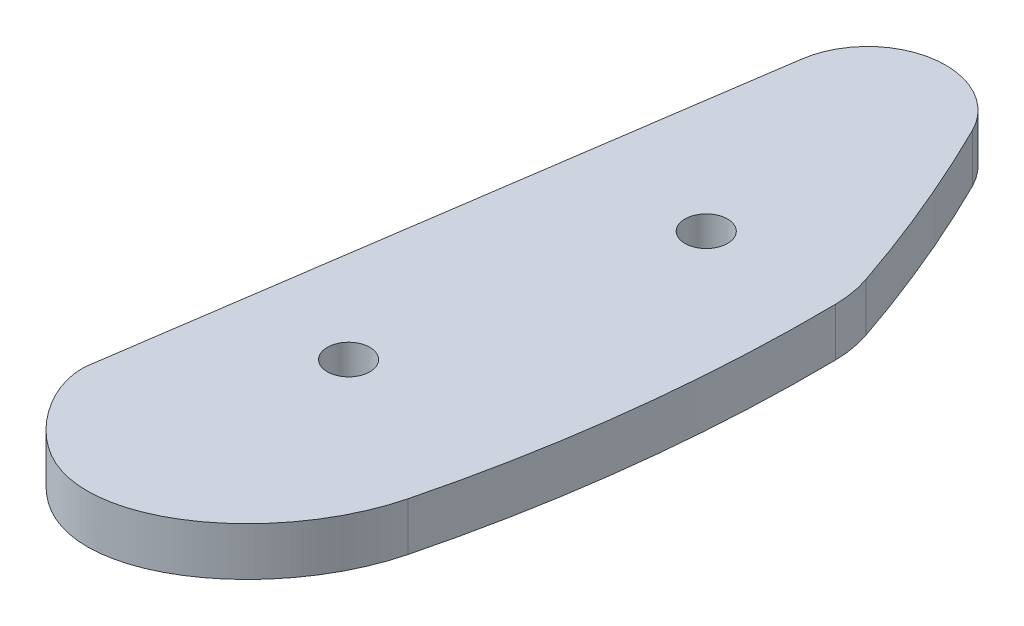
ISO-10303-21;
HEADER;
FILE_DESCRIPTION(('STEP AP214'),'2;1');
FILE_NAME('part.step','',(''),(''),'','','');
FILE_SCHEMA(('AUTOMOTIVE_DESIGN { 1 0 10303 214 1 1 1 1 }'));
ENDSEC;
DATA;
#1=APPLICATION_CONTEXT('core data for automotive mechanical design processes');
#2=APPLICATION_PROTOCOL_DEFINITION('international standard','automotive_design',2000,#1);
#3=PRODUCT_CONTEXT('',#1,'mechanical');
#4=PRODUCT('Part','Part','',(#3));
#5=PRODUCT_RELATED_PRODUCT_CATEGORY('part','',(#4));
#6=PRODUCT_DEFINITION_FORMATION('','',#4);
#7=PRODUCT_DEFINITION_CONTEXT('part definition',#1,'design');
#8=PRODUCT_DEFINITION('design','',#6,#7);
#9=PRODUCT_DEFINITION_SHAPE('','',#8);
#10=(LENGTH_UNIT() NAMED_UNIT(*) SI_UNIT(.MILLI.,.METRE.));
#11=(NAMED_UNIT(*) PLANE_ANGLE_UNIT() SI_UNIT($,.RADIAN.));
#12=(NAMED_UNIT(*) SI_UNIT($,.STERADIAN.) SOLID_ANGLE_UNIT());
#13=UNCERTAINTY_MEASURE_WITH_UNIT(LENGTH_MEASURE(1.E-05),#10,'distance_accuracy_value','');
#14=(GEOMETRIC_REPRESENTATION_CONTEXT(3) GLOBAL_UNCERTAINTY_ASSIGNED_CONTEXT((#13)) GLOBAL_UNIT_ASSIGNED_CONTEXT((#10,
#11,#12)) REPRESENTATION_CONTEXT('',''));
#15=CARTESIAN_POINT('',(0.,0.,0.));
#16=DIRECTION('',(0.,0.,1.));
#17=DIRECTION('',(1.,0.,0.));
#18=AXIS2_PLACEMENT_3D('',#15,#16,#17);
#19=CARTESIAN_POINT('',(-22.4565511628832,5.,-100.599709115054));
#20=CARTESIAN_POINT('',(-25.1764779230454,5.,-89.8621553185088));
#21=CARTESIAN_POINT('',(-41.6352271879597,5.,-77.5167924573556));
#22=CARTESIAN_POINT('',(-51.4058255473485,5.,-92.8365994296526));
#23=CARTESIAN_POINT('',(-50.9327114839769,5.,-96.0562150670269));
#24=B_SPLINE_CURVE_WITH_KNOTS('',3,(#19,#20,#21,#22,#23),.UNSPECIFIED.,.F.,.F.,(4,1,4),(0.,
0.694817921891627,1.),.UNSPECIFIED.);
#25=DIRECTION('',(0.,-1.,0.));
#26=VECTOR('',#25,1.);
#27=SURFACE_OF_LINEAR_EXTRUSION('',#24,#26);
#28=CARTESIAN_POINT('',(-22.4565511628832,0.,-100.599709115054));
#29=CARTESIAN_POINT('',(-25.1764779230454,0.,-89.8621553185088));
#30=CARTESIAN_POINT('',(-41.6352271879597,0.,-77.5167924573556));
#31=CARTESIAN_POINT('',(-51.4058255473485,0.,-92.8365994296526));
#32=CARTESIAN_POINT('',(-50.9327114839769,0.,-96.0562150670269));
#33=B_SPLINE_CURVE_WITH_KNOTS('',3,(#28,#29,#30,#31,#32),.UNSPECIFIED.,.F.,.F.,(4,1,4),(0.,
0.694817921891627,1.),.UNSPECIFIED.);
#34=CARTESIAN_POINT('',(-22.4565511628832,0.,-100.599709115054));
#35=VERTEX_POINT('',#34);
#36=CARTESIAN_POINT('',(-50.9790818425515,0.,-95.5373017092826));
#37=VERTEX_POINT('',#36);
#38=EDGE_CURVE('E176',#35,#37,#33,.T.);
#39=ORIENTED_EDGE('',*,*,#38,.F.);
#40=DIRECTION('',(0.,-1.,0.));
#41=VECTOR('',#40,1.);
#42=CARTESIAN_POINT('',(-22.4565511628832,5.,-100.599709115054));
#43=LINE('',#42,#41);
#44=CARTESIAN_POINT('',(-22.4565511628832,5.,-100.599709115054));
#45=VERTEX_POINT('',#44);
#46=EDGE_CURVE('E12',#45,#35,#43,.T.);
#47=ORIENTED_EDGE('',*,*,#46,.F.);
#48=CARTESIAN_POINT('',(-50.9790818425515,5.,-95.5373017092826));
#49=VERTEX_POINT('',#48);
#50=EDGE_CURVE('E150',#45,#49,#24,.T.);
#51=ORIENTED_EDGE('',*,*,#50,.T.);
#52=DIRECTION('',(0.,-1.,0.));
#53=VECTOR('',#52,1.);
#54=CARTESIAN_POINT('',(-50.9790818425515,5.,-95.5373017092826));
#55=LINE('',#54,#53);
#56=EDGE_CURVE('E92',#49,#37,#55,.T.);
#57=ORIENTED_EDGE('',*,*,#56,.T.);
#58=EDGE_LOOP('',(#39,#47,#51,#57));
#59=FACE_BOUND('',#58,.T.);
#60=ADVANCED_FACE('F43',(#59),#27,.T.);
#61=CARTESIAN_POINT('',(-171.2572125516,5.,-138.292363187831));
#62=DIRECTION('',(0.,-1.,0.));
#63=DIRECTION('',(0.,0.,-1.));
#64=AXIS2_PLACEMENT_3D('',#61,#62,#63);
#65=CYLINDRICAL_SURFACE('',#64,153.500400653449);
#66=CARTESIAN_POINT('',(-171.2572125516,0.,-138.292363187831));
#67=DIRECTION('',(0.,1.,0.));
#68=DIRECTION('',(0.,0.,1.));
#69=AXIS2_PLACEMENT_3D('',#66,#67,#68);
#70=CIRCLE('',#69,153.500400653449);
#71=CARTESIAN_POINT('',(-17.7680269599981,0.,-140.147870449029));
#72=VERTEX_POINT('',#71);
#73=EDGE_CURVE('E181',#35,#72,#70,.T.);
#74=ORIENTED_EDGE('',*,*,#73,.T.);
#75=DIRECTION('',(0.,-1.,0.));
#76=VECTOR('',#75,1.);
#77=CARTESIAN_POINT('',(-17.7680269599981,5.,-140.147870449029));
#78=LINE('',#77,#76);
#79=CARTESIAN_POINT('',(-17.7680269599981,5.,-140.147870449029));
#80=VERTEX_POINT('',#79);
#81=EDGE_CURVE('E52',#80,#72,#78,.T.);
#82=ORIENTED_EDGE('',*,*,#81,.F.);
#83=CARTESIAN_POINT('',(-171.2572125516,5.,-138.292363187831));
#84=DIRECTION('',(0.,1.,0.));
#85=DIRECTION('',(0.,0.,1.));
#86=AXIS2_PLACEMENT_3D('',#83,#84,#85);
#87=CIRCLE('',#86,153.500400653449);
#88=EDGE_CURVE('E147',#45,#80,#87,.T.);
#89=ORIENTED_EDGE('',*,*,#88,.F.);
#90=ORIENTED_EDGE('',*,*,#46,.T.);
#91=EDGE_LOOP('',(#74,#82,#89,#90));
#92=FACE_BOUND('',#91,.T.);
#93=ADVANCED_FACE('F224',(#92),#65,.T.);
#94=CARTESIAN_POINT('',(-30.,5.,-140.));
#95=DIRECTION('',(0.,-1.,0.));
#96=DIRECTION('',(0.,0.,-1.));
#97=AXIS2_PLACEMENT_3D('',#94,#95,#96);
#98=CYLINDRICAL_SURFACE('',#97,12.2328667989573);
#99=CARTESIAN_POINT('',(-30.,0.,-140.));
#100=DIRECTION('',(0.,1.,0.));
#101=DIRECTION('',(0.,0.,1.));
#102=AXIS2_PLACEMENT_3D('',#99,#100,#101);
#103=CIRCLE('',#102,12.2328667989573);
#104=CARTESIAN_POINT('',(-18.4178287610432,0.,-143.93653902718));
#105=VERTEX_POINT('',#104);
#106=EDGE_CURVE('E185',#72,#105,#103,.T.);
#107=ORIENTED_EDGE('',*,*,#106,.T.);
#108=DIRECTION('',(0.,-1.,0.));
#109=VECTOR('',#108,1.);
#110=CARTESIAN_POINT('',(-18.4178287610432,5.,-143.93653902718));
#111=LINE('',#110,#109);
#112=CARTESIAN_POINT('',(-18.4178287610432,5.,-143.93653902718));
#113=VERTEX_POINT('',#112);
#114=EDGE_CURVE('E203',#113,#105,#111,.T.);
#115=ORIENTED_EDGE('',*,*,#114,.F.);
#116=CARTESIAN_POINT('',(-30.,5.,-140.));
#117=DIRECTION('',(0.,1.,0.));
#118=DIRECTION('',(0.,0.,1.));
#119=AXIS2_PLACEMENT_3D('',#116,#117,#118);
#120=CIRCLE('',#119,12.2328667989573);
#121=EDGE_CURVE('E143',#80,#113,#120,.T.);
#122=ORIENTED_EDGE('',*,*,#121,.F.);
#123=ORIENTED_EDGE('',*,*,#81,.T.);
#124=EDGE_LOOP('',(#107,#115,#122,#123));
#125=FACE_BOUND('',#124,.T.);
#126=ADVANCED_FACE('F210',(#125),#98,.T.);
#127=CARTESIAN_POINT('',(-163.753174500954,5.,-94.5400788358876));
#128=DIRECTION('',(0.,-1.,0.));
#129=DIRECTION('',(0.,0.,-1.));
#130=AXIS2_PLACEMENT_3D('',#127,#128,#129);
#131=CYLINDRICAL_SURFACE('',#130,153.500400653449);
#132=CARTESIAN_POINT('',(-163.753174500954,0.,-94.5400788358876));
#133=DIRECTION('',(0.,1.,0.));
#134=DIRECTION('',(0.,0.,1.));
#135=AXIS2_PLACEMENT_3D('',#132,#133,#134);
#136=CIRCLE('',#135,153.500400653449);
#137=CARTESIAN_POINT('',(-26.2562949035577,0.,-162.782156044517));
#138=VERTEX_POINT('',#137);
#139=EDGE_CURVE('E194',#105,#138,#136,.T.);
#140=ORIENTED_EDGE('',*,*,#139,.T.);
#141=DIRECTION('',(0.,-1.,0.));
#142=VECTOR('',#141,1.);
#143=CARTESIAN_POINT('',(-26.2562949035577,5.,-162.782156044517));
#144=LINE('',#143,#142);
#145=CARTESIAN_POINT('',(-26.2562949035577,5.,-162.782156044517));
#146=VERTEX_POINT('',#145);
#147=EDGE_CURVE('E124',#146,#138,#144,.T.);
#148=ORIENTED_EDGE('',*,*,#147,.F.);
#149=CARTESIAN_POINT('',(-163.753174500954,5.,-94.5400788358876));
#150=DIRECTION('',(0.,1.,0.));
#151=DIRECTION('',(0.,0.,1.));
#152=AXIS2_PLACEMENT_3D('',#149,#150,#151);
#153=CIRCLE('',#152,153.500400653449);
#154=EDGE_CURVE('E114',#113,#146,#153,.T.);
#155=ORIENTED_EDGE('',*,*,#154,.F.);
#156=ORIENTED_EDGE('',*,*,#114,.T.);
#157=EDGE_LOOP('',(#140,#148,#155,#156));
#158=FACE_BOUND('',#157,.T.);
#159=ADVANCED_FACE('F216',(#158),#131,.T.);
#160=CARTESIAN_POINT('',(-33.4913170526785,5.,-159.191289535021));
#161=DIRECTION('',(0.,-1.,0.));
#162=DIRECTION('',(0.,0.,-1.));
#163=AXIS2_PLACEMENT_3D('',#160,#161,#162);
#164=CYLINDRICAL_SURFACE('',#163,8.0771200181305);
#165=CARTESIAN_POINT('',(-33.4913170526785,0.,-159.191289535021));
#166=DIRECTION('',(0.,1.,0.));
#167=DIRECTION('',(0.,0.,1.));
#168=AXIS2_PLACEMENT_3D('',#165,#166,#167);
#169=CIRCLE('',#168,8.0771200181305);
#170=CARTESIAN_POINT('',(-41.4826176844214,0.,-160.365590178123));
#171=VERTEX_POINT('',#170);
#172=EDGE_CURVE('E123',#138,#171,#169,.T.);
#173=ORIENTED_EDGE('',*,*,#172,.T.);
#174=DIRECTION('',(0.,-1.,0.));
#175=VECTOR('',#174,1.);
#176=CARTESIAN_POINT('',(-41.4826176844214,5.,-160.365590178123));
#177=LINE('',#176,#175);
#178=CARTESIAN_POINT('',(-41.4826176844214,5.,-160.365590178123));
#179=VERTEX_POINT('',#178);
#180=EDGE_CURVE('E120',#179,#171,#177,.T.);
#181=ORIENTED_EDGE('',*,*,#180,.F.);
#182=CARTESIAN_POINT('',(-33.4913170526785,5.,-159.191289535021));
#183=DIRECTION('',(0.,1.,0.));
#184=DIRECTION('',(0.,0.,1.));
#185=AXIS2_PLACEMENT_3D('',#182,#183,#184);
#186=CIRCLE('',#185,8.0771200181305);
#187=EDGE_CURVE('E108',#146,#179,#186,.T.);
#188=ORIENTED_EDGE('',*,*,#187,.F.);
#189=ORIENTED_EDGE('',*,*,#147,.T.);
#190=EDGE_LOOP('',(#173,#181,#188,#189));
#191=FACE_BOUND('',#190,.T.);
#192=ADVANCED_FACE('F121',(#191),#164,.T.);
#193=CARTESIAN_POINT('',(-63.6729952688219,5.,-9.35657945283316));
#194=DIRECTION('',(0.989375001709163,0.,0.145386058454699));
#195=DIRECTION('',(0.145386058454699,0.,-0.989375001709163));
#196=AXIS2_PLACEMENT_3D('',#193,#194,#195);
#197=PLANE('',#196);
#198=DIRECTION('',(-0.145386058454699,0.,0.989375001709163));
#199=VECTOR('',#198,1.);
#200=CARTESIAN_POINT('',(-63.6729952688219,0.,-9.35657945283316));
#201=LINE('',#200,#199);
#202=CARTESIAN_POINT('',(-50.9327114839769,0.,-96.0562150670269));
#203=VERTEX_POINT('',#202);
#204=EDGE_CURVE('E85',#171,#203,#201,.T.);
#205=ORIENTED_EDGE('',*,*,#204,.T.);
#206=DIRECTION('',(0.,-1.,0.));
#207=VECTOR('',#206,1.);
#208=CARTESIAN_POINT('',(-50.9327114839769,5.,-96.0562150670269));
#209=LINE('',#208,#207);
#210=CARTESIAN_POINT('',(-50.9327114839769,5.,-96.0562150670269));
#211=VERTEX_POINT('',#210);
#212=EDGE_CURVE('E125',#211,#203,#209,.T.);
#213=ORIENTED_EDGE('',*,*,#212,.F.);
#214=DIRECTION('',(-0.145386058454699,0.,0.989375001709163));
#215=VECTOR('',#214,1.);
#216=CARTESIAN_POINT('',(-63.6729952688219,5.,-9.35657945283316));
#217=LINE('',#216,#215);
#218=EDGE_CURVE('E112',#179,#211,#217,.T.);
#219=ORIENTED_EDGE('',*,*,#218,.F.);
#220=ORIENTED_EDGE('',*,*,#180,.T.);
#221=EDGE_LOOP('',(#205,#213,#219,#220));
#222=FACE_BOUND('',#221,.T.);
#223=ADVANCED_FACE('F127',(#222),#197,.F.);
#224=CARTESIAN_POINT('',(0.00716740026227708,5.,-91.2426733575386));
#225=DIRECTION('',(0.,-1.,0.));
#226=DIRECTION('',(0.,0.,-1.));
#227=AXIS2_PLACEMENT_3D('',#224,#225,#226);
#228=CYLINDRICAL_SURFACE('',#227,51.1668002178164);
#229=CARTESIAN_POINT('',(0.00716740026227708,0.,-91.2426733575386));
#230=DIRECTION('',(0.,1.,0.));
#231=DIRECTION('',(0.,0.,1.));
#232=AXIS2_PLACEMENT_3D('',#229,#230,#231);
#233=CIRCLE('',#232,51.1668002178164);
#234=EDGE_CURVE('E198',#203,#37,#233,.T.);
#235=ORIENTED_EDGE('',*,*,#234,.T.);
#236=ORIENTED_EDGE('',*,*,#56,.F.);
#237=CARTESIAN_POINT('',(0.00716740026227708,5.,-91.2426733575386));
#238=DIRECTION('',(0.,1.,0.));
#239=DIRECTION('',(0.,0.,1.));
#240=AXIS2_PLACEMENT_3D('',#237,#238,#239);
#241=CIRCLE('',#240,51.1668002178164);
#242=EDGE_CURVE('E60',#211,#49,#241,.T.);
#243=ORIENTED_EDGE('',*,*,#242,.F.);
#244=ORIENTED_EDGE('',*,*,#212,.T.);
#245=EDGE_LOOP('',(#235,#236,#243,#244));
#246=FACE_BOUND('',#245,.T.);
#247=ADVANCED_FACE('F256',(#246),#228,.T.);
#248=CARTESIAN_POINT('',(0.,5.,0.));
#249=DIRECTION('',(0.,1.,0.));
#250=DIRECTION('',(0.,0.,1.));
#251=AXIS2_PLACEMENT_3D('',#248,#249,#250);
#252=PLANE('',#251);
#253=CARTESIAN_POINT('',(-31.0000000000001,5.,-140.));
#254=DIRECTION('',(0.,1.,0.));
#255=DIRECTION('',(0.,0.,1.));
#256=AXIS2_PLACEMENT_3D('',#253,#254,#255);
#257=CIRCLE('',#256,2.2);
#258=CARTESIAN_POINT('',(-31.0000000000001,5.,-137.8));
#259=VERTEX_POINT('',#258);
#260=EDGE_CURVE('E168',#259,#259,#257,.T.);
#261=ORIENTED_EDGE('',*,*,#260,.F.);
#262=EDGE_LOOP('',(#261));
#263=FACE_BOUND('',#262,.T.);
#264=CARTESIAN_POINT('',(-38.0000000000001,5.,-110.));
#265=DIRECTION('',(0.,1.,0.));
#266=DIRECTION('',(0.,0.,1.));
#267=AXIS2_PLACEMENT_3D('',#264,#265,#266);
#268=CIRCLE('',#267,2.2);
#269=CARTESIAN_POINT('',(-38.0000000000001,5.,-107.8));
#270=VERTEX_POINT('',#269);
#271=EDGE_CURVE('E160',#270,#270,#268,.T.);
#272=ORIENTED_EDGE('',*,*,#271,.F.);
#273=EDGE_LOOP('',(#272));
#274=FACE_BOUND('',#273,.T.);
#275=ORIENTED_EDGE('',*,*,#50,.F.);
#276=ORIENTED_EDGE('',*,*,#88,.T.);
#277=ORIENTED_EDGE('',*,*,#121,.T.);
#278=ORIENTED_EDGE('',*,*,#154,.T.);
#279=ORIENTED_EDGE('',*,*,#187,.T.);
#280=ORIENTED_EDGE('',*,*,#218,.T.);
#281=ORIENTED_EDGE('',*,*,#242,.T.);
#282=EDGE_LOOP('',(#275,#276,#277,#278,#279,#280,#281));
#283=FACE_BOUND('',#282,.T.);
#284=ADVANCED_FACE('F110',(#263,#274,#283),#252,.T.);
#285=CARTESIAN_POINT('',(0.,0.,0.));
#286=DIRECTION('',(0.,1.,0.));
#287=DIRECTION('',(0.,0.,1.));
#288=AXIS2_PLACEMENT_3D('',#285,#286,#287);
#289=PLANE('',#288);
#290=CARTESIAN_POINT('',(-31.0000000000001,0.,-140.));
#291=DIRECTION('',(0.,1.,0.));
#292=DIRECTION('',(0.,0.,1.));
#293=AXIS2_PLACEMENT_3D('',#290,#291,#292);
#294=CIRCLE('',#293,2.2);
#295=CARTESIAN_POINT('',(-31.0000000000001,0.,-137.8));
#296=VERTEX_POINT('',#295);
#297=EDGE_CURVE('E166',#296,#296,#294,.F.);
#298=ORIENTED_EDGE('',*,*,#297,.F.);
#299=EDGE_LOOP('',(#298));
#300=FACE_BOUND('',#299,.T.);
#301=CARTESIAN_POINT('',(-38.0000000000001,0.,-110.));
#302=DIRECTION('',(0.,1.,0.));
#303=DIRECTION('',(0.,0.,1.));
#304=AXIS2_PLACEMENT_3D('',#301,#302,#303);
#305=CIRCLE('',#304,2.2);
#306=CARTESIAN_POINT('',(-38.0000000000001,0.,-107.8));
#307=VERTEX_POINT('',#306);
#308=EDGE_CURVE('E165',#307,#307,#305,.F.);
#309=ORIENTED_EDGE('',*,*,#308,.F.);
#310=EDGE_LOOP('',(#309));
#311=FACE_BOUND('',#310,.T.);
#312=ORIENTED_EDGE('',*,*,#38,.T.);
#313=ORIENTED_EDGE('',*,*,#234,.F.);
#314=ORIENTED_EDGE('',*,*,#204,.F.);
#315=ORIENTED_EDGE('',*,*,#172,.F.);
#316=ORIENTED_EDGE('',*,*,#139,.F.);
#317=ORIENTED_EDGE('',*,*,#106,.F.);
#318=ORIENTED_EDGE('',*,*,#73,.F.);
#319=EDGE_LOOP('',(#312,#313,#314,#315,#316,#317,#318));
#320=FACE_BOUND('',#319,.T.);
#321=ADVANCED_FACE('F214',(#300,#311,#320),#289,.F.);
#322=CARTESIAN_POINT('',(-38.0000000000001,-0.00100000000000013,-110.));
#323=DIRECTION('',(0.,1.,0.));
#324=DIRECTION('',(0.,0.,1.));
#325=AXIS2_PLACEMENT_3D('',#322,#323,#324);
#326=CYLINDRICAL_SURFACE('',#325,2.2);
#327=ORIENTED_EDGE('',*,*,#271,.T.);
#328=EDGE_LOOP('',(#327));
#329=FACE_BOUND('',#328,.T.);
#330=ORIENTED_EDGE('',*,*,#308,.T.);
#331=EDGE_LOOP('',(#330));
#332=FACE_BOUND('',#331,.T.);
#333=ADVANCED_FACE('F280',(#329,#332),#326,.F.);
#334=CARTESIAN_POINT('',(-31.0000000000001,-0.00100000000000013,-140.));
#335=DIRECTION('',(0.,1.,0.));
#336=DIRECTION('',(0.,0.,1.));
#337=AXIS2_PLACEMENT_3D('',#334,#335,#336);
#338=CYLINDRICAL_SURFACE('',#337,2.2);
#339=ORIENTED_EDGE('',*,*,#260,.T.);
#340=EDGE_LOOP('',(#339));
#341=FACE_BOUND('',#340,.T.);
#342=ORIENTED_EDGE('',*,*,#297,.T.);
#343=EDGE_LOOP('',(#342));
#344=FACE_BOUND('',#343,.T.);
#345=ADVANCED_FACE('F289',(#341,#344),#338,.F.);
#346=CLOSED_SHELL('',(#60,#93,#126,#159,#192,#223,#247,#284,#321,#333,#345));
#347=MANIFOLD_SOLID_BREP('B2',#346);
#348=ADVANCED_BREP_SHAPE_REPRESENTATION('',(#18,#347),#14);
#349=SHAPE_DEFINITION_REPRESENTATION(#9,#348);
ENDSEC;
END-ISO-10303-21;
